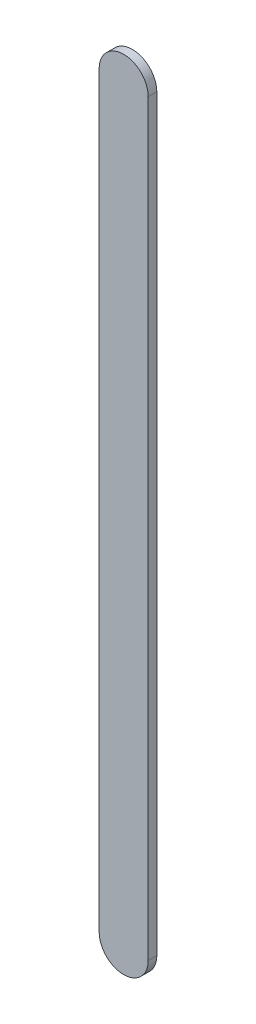
ISO-10303-21;
HEADER;
FILE_DESCRIPTION(('STEP AP214'),'2;1');
FILE_NAME('part.step','',(''),(''),'','','');
FILE_SCHEMA(('AUTOMOTIVE_DESIGN { 1 0 10303 214 1 1 1 1 }'));
ENDSEC;
DATA;
#1=APPLICATION_CONTEXT('core data for automotive mechanical design processes');
#2=APPLICATION_PROTOCOL_DEFINITION('international standard','automotive_design',2000,#1);
#3=PRODUCT_CONTEXT('',#1,'mechanical');
#4=PRODUCT('Part','Part','',(#3));
#5=PRODUCT_RELATED_PRODUCT_CATEGORY('part','',(#4));
#6=PRODUCT_DEFINITION_FORMATION('','',#4);
#7=PRODUCT_DEFINITION_CONTEXT('part definition',#1,'design');
#8=PRODUCT_DEFINITION('design','',#6,#7);
#9=PRODUCT_DEFINITION_SHAPE('','',#8);
#10=(LENGTH_UNIT() NAMED_UNIT(*) SI_UNIT(.MILLI.,.METRE.));
#11=(NAMED_UNIT(*) PLANE_ANGLE_UNIT() SI_UNIT($,.RADIAN.));
#12=(NAMED_UNIT(*) SI_UNIT($,.STERADIAN.) SOLID_ANGLE_UNIT());
#13=UNCERTAINTY_MEASURE_WITH_UNIT(LENGTH_MEASURE(1.E-05),#10,'distance_accuracy_value','');
#14=(GEOMETRIC_REPRESENTATION_CONTEXT(3) GLOBAL_UNCERTAINTY_ASSIGNED_CONTEXT((#13)) GLOBAL_UNIT_ASSIGNED_CONTEXT((#10,
#11,#12)) REPRESENTATION_CONTEXT('',''));
#15=CARTESIAN_POINT('',(0.,0.,0.));
#16=DIRECTION('',(0.,0.,1.));
#17=DIRECTION('',(1.,0.,0.));
#18=AXIS2_PLACEMENT_3D('',#15,#16,#17);
#19=CARTESIAN_POINT('',(95.81,-137.4,1.635));
#20=DIRECTION('',(0.,0.,1.));
#21=DIRECTION('',(1.,0.,0.));
#22=AXIS2_PLACEMENT_3D('',#19,#20,#21);
#23=PLANE('',#22);
#24=DIRECTION('',(0.,-1.,0.));
#25=VECTOR('',#24,1.);
#26=CARTESIAN_POINT('',(95.81,-137.4,1.635));
#27=LINE('',#26,#25);
#28=CARTESIAN_POINT('',(95.81,-137.4,1.635));
#29=VERTEX_POINT('',#28);
#30=CARTESIAN_POINT('',(95.81,-140.45,1.635));
#31=VERTEX_POINT('',#30);
#32=EDGE_CURVE('E91',#29,#31,#27,.T.);
#33=ORIENTED_EDGE('',*,*,#32,.T.);
#34=CARTESIAN_POINT('',(95.91,-140.45,1.635));
#35=DIRECTION('',(0.,0.,1.));
#36=DIRECTION('',(-1.,2.84217094304E-13,0.));
#37=AXIS2_PLACEMENT_3D('',#34,#35,#36);
#38=CIRCLE('',#37,0.1);
#39=CARTESIAN_POINT('',(96.01,-140.45,1.635));
#40=VERTEX_POINT('',#39);
#41=EDGE_CURVE('E86',#31,#40,#38,.T.);
#42=ORIENTED_EDGE('',*,*,#41,.T.);
#43=DIRECTION('',(0.,1.,0.));
#44=VECTOR('',#43,1.);
#45=CARTESIAN_POINT('',(96.01,-140.45,1.635));
#46=LINE('',#45,#44);
#47=CARTESIAN_POINT('',(96.01,-137.4,1.635));
#48=VERTEX_POINT('',#47);
#49=EDGE_CURVE('E112',#40,#48,#46,.T.);
#50=ORIENTED_EDGE('',*,*,#49,.T.);
#51=CARTESIAN_POINT('',(95.91,-137.4,1.635));
#52=DIRECTION('',(0.,0.,1.));
#53=DIRECTION('',(1.,2.842170943041E-13,0.));
#54=AXIS2_PLACEMENT_3D('',#51,#52,#53);
#55=CIRCLE('',#54,0.1);
#56=EDGE_CURVE('E11',#48,#29,#55,.T.);
#57=ORIENTED_EDGE('',*,*,#56,.T.);
#58=EDGE_LOOP('',(#33,#42,#50,#57));
#59=FACE_BOUND('',#58,.T.);
#60=ADVANCED_FACE('F17',(#59),#23,.T.);
#61=CARTESIAN_POINT('',(95.81,-137.4,1.6));
#62=DIRECTION('',(0.,0.,1.));
#63=DIRECTION('',(1.,0.,0.));
#64=AXIS2_PLACEMENT_3D('',#61,#62,#63);
#65=PLANE('',#64);
#66=CARTESIAN_POINT('',(95.91,-137.4,1.6));
#67=DIRECTION('',(0.,0.,1.));
#68=DIRECTION('',(1.,2.842170943041E-13,0.));
#69=AXIS2_PLACEMENT_3D('',#66,#67,#68);
#70=CIRCLE('',#69,0.1);
#71=CARTESIAN_POINT('',(96.01,-137.4,1.6));
#72=VERTEX_POINT('',#71);
#73=CARTESIAN_POINT('',(95.81,-137.4,1.6));
#74=VERTEX_POINT('',#73);
#75=EDGE_CURVE('E26',#72,#74,#70,.T.);
#76=ORIENTED_EDGE('',*,*,#75,.F.);
#77=DIRECTION('',(0.,1.,0.));
#78=VECTOR('',#77,1.);
#79=CARTESIAN_POINT('',(96.01,-140.45,1.6));
#80=LINE('',#79,#78);
#81=CARTESIAN_POINT('',(96.01,-140.45,1.6));
#82=VERTEX_POINT('',#81);
#83=EDGE_CURVE('E74',#82,#72,#80,.T.);
#84=ORIENTED_EDGE('',*,*,#83,.F.);
#85=CARTESIAN_POINT('',(95.91,-140.45,1.6));
#86=DIRECTION('',(0.,0.,1.));
#87=DIRECTION('',(-1.,2.84217094304E-13,0.));
#88=AXIS2_PLACEMENT_3D('',#85,#86,#87);
#89=CIRCLE('',#88,0.1);
#90=CARTESIAN_POINT('',(95.81,-140.45,1.6));
#91=VERTEX_POINT('',#90);
#92=EDGE_CURVE('E68',#91,#82,#89,.T.);
#93=ORIENTED_EDGE('',*,*,#92,.F.);
#94=DIRECTION('',(0.,-1.,0.));
#95=VECTOR('',#94,1.);
#96=CARTESIAN_POINT('',(95.81,-137.4,1.6));
#97=LINE('',#96,#95);
#98=EDGE_CURVE('E72',#74,#91,#97,.T.);
#99=ORIENTED_EDGE('',*,*,#98,.F.);
#100=EDGE_LOOP('',(#76,#84,#93,#99));
#101=FACE_BOUND('',#100,.T.);
#102=ADVANCED_FACE('F70',(#101),#65,.F.);
#103=CARTESIAN_POINT('',(95.91,-137.4,1.6));
#104=DIRECTION('',(0.,0.,-1.));
#105=DIRECTION('',(1.,2.842170943041E-13,0.));
#106=AXIS2_PLACEMENT_3D('',#103,#104,#105);
#107=CYLINDRICAL_SURFACE('',#106,0.1);
#108=ORIENTED_EDGE('',*,*,#75,.T.);
#109=DIRECTION('',(0.,0.,1.));
#110=VECTOR('',#109,1.);
#111=CARTESIAN_POINT('',(95.81,-137.4,1.6));
#112=LINE('',#111,#110);
#113=EDGE_CURVE('E80',#74,#29,#112,.T.);
#114=ORIENTED_EDGE('',*,*,#113,.T.);
#115=ORIENTED_EDGE('',*,*,#56,.F.);
#116=DIRECTION('',(0.,0.,1.));
#117=VECTOR('',#116,1.);
#118=CARTESIAN_POINT('',(96.01,-137.4,1.6));
#119=LINE('',#118,#117);
#120=EDGE_CURVE('E105',#72,#48,#119,.T.);
#121=ORIENTED_EDGE('',*,*,#120,.F.);
#122=EDGE_LOOP('',(#108,#114,#115,#121));
#123=FACE_BOUND('',#122,.T.);
#124=ADVANCED_FACE('F19',(#123),#107,.T.);
#125=CARTESIAN_POINT('',(96.01,-140.45,1.6));
#126=DIRECTION('',(-1.,0.,0.));
#127=DIRECTION('',(0.,0.,1.));
#128=AXIS2_PLACEMENT_3D('',#125,#126,#127);
#129=PLANE('',#128);
#130=ORIENTED_EDGE('',*,*,#83,.T.);
#131=ORIENTED_EDGE('',*,*,#120,.T.);
#132=ORIENTED_EDGE('',*,*,#49,.F.);
#133=DIRECTION('',(0.,0.,1.));
#134=VECTOR('',#133,1.);
#135=CARTESIAN_POINT('',(96.01,-140.45,1.6));
#136=LINE('',#135,#134);
#137=EDGE_CURVE('E79',#82,#40,#136,.T.);
#138=ORIENTED_EDGE('',*,*,#137,.F.);
#139=EDGE_LOOP('',(#130,#131,#132,#138));
#140=FACE_BOUND('',#139,.T.);
#141=ADVANCED_FACE('F122',(#140),#129,.F.);
#142=CARTESIAN_POINT('',(95.91,-140.45,1.6));
#143=DIRECTION('',(0.,0.,-1.));
#144=DIRECTION('',(-1.,2.84217094304E-13,0.));
#145=AXIS2_PLACEMENT_3D('',#142,#143,#144);
#146=CYLINDRICAL_SURFACE('',#145,0.1);
#147=ORIENTED_EDGE('',*,*,#92,.T.);
#148=ORIENTED_EDGE('',*,*,#137,.T.);
#149=ORIENTED_EDGE('',*,*,#41,.F.);
#150=DIRECTION('',(0.,0.,1.));
#151=VECTOR('',#150,1.);
#152=CARTESIAN_POINT('',(95.81,-140.45,1.6));
#153=LINE('',#152,#151);
#154=EDGE_CURVE('E83',#91,#31,#153,.T.);
#155=ORIENTED_EDGE('',*,*,#154,.F.);
#156=EDGE_LOOP('',(#147,#148,#149,#155));
#157=FACE_BOUND('',#156,.T.);
#158=ADVANCED_FACE('F84',(#157),#146,.T.);
#159=CARTESIAN_POINT('',(95.81,-137.4,1.6));
#160=DIRECTION('',(1.,0.,0.));
#161=DIRECTION('',(0.,1.,0.));
#162=AXIS2_PLACEMENT_3D('',#159,#160,#161);
#163=PLANE('',#162);
#164=ORIENTED_EDGE('',*,*,#98,.T.);
#165=ORIENTED_EDGE('',*,*,#154,.T.);
#166=ORIENTED_EDGE('',*,*,#32,.F.);
#167=ORIENTED_EDGE('',*,*,#113,.F.);
#168=EDGE_LOOP('',(#164,#165,#166,#167));
#169=FACE_BOUND('',#168,.T.);
#170=ADVANCED_FACE('F94',(#169),#163,.F.);
#171=CLOSED_SHELL('',(#60,#102,#124,#141,#158,#170));
#172=MANIFOLD_SOLID_BREP('B1',#171);
#173=ADVANCED_BREP_SHAPE_REPRESENTATION('',(#18,#172),#14);
#174=SHAPE_DEFINITION_REPRESENTATION(#9,#173);
ENDSEC;
END-ISO-10303-21;
